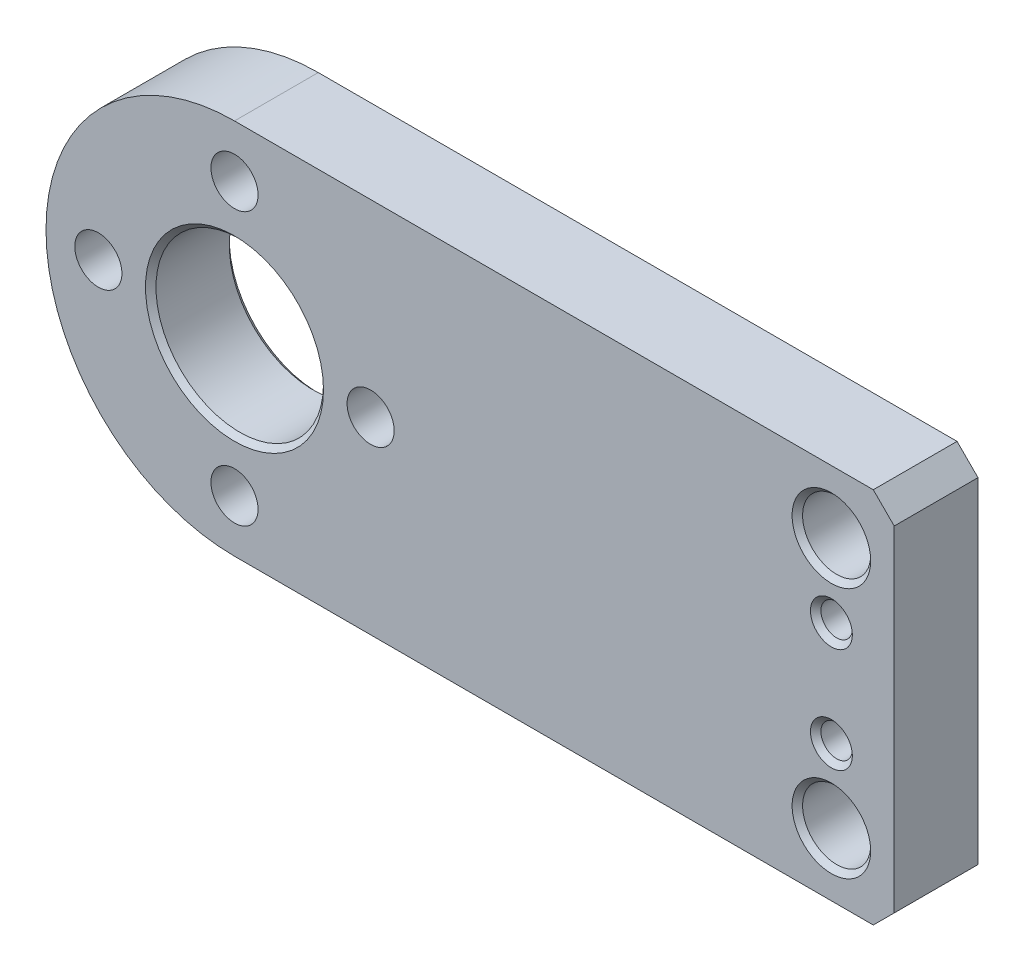
ISO-10303-21;
HEADER;
FILE_DESCRIPTION(('STEP AP214'),'2;1');
FILE_NAME('part.step','',(''),(''),'','','');
FILE_SCHEMA(('AUTOMOTIVE_DESIGN { 1 0 10303 214 1 1 1 1 }'));
ENDSEC;
DATA;
#1=APPLICATION_CONTEXT('core data for automotive mechanical design processes');
#2=APPLICATION_PROTOCOL_DEFINITION('international standard','automotive_design',2000,#1);
#3=PRODUCT_CONTEXT('',#1,'mechanical');
#4=PRODUCT('Part','Part','',(#3));
#5=PRODUCT_RELATED_PRODUCT_CATEGORY('part','',(#4));
#6=PRODUCT_DEFINITION_FORMATION('','',#4);
#7=PRODUCT_DEFINITION_CONTEXT('part definition',#1,'design');
#8=PRODUCT_DEFINITION('design','',#6,#7);
#9=PRODUCT_DEFINITION_SHAPE('','',#8);
#10=(LENGTH_UNIT() NAMED_UNIT(*) SI_UNIT(.MILLI.,.METRE.));
#11=(NAMED_UNIT(*) PLANE_ANGLE_UNIT() SI_UNIT($,.RADIAN.));
#12=(NAMED_UNIT(*) SI_UNIT($,.STERADIAN.) SOLID_ANGLE_UNIT());
#13=UNCERTAINTY_MEASURE_WITH_UNIT(LENGTH_MEASURE(1.E-05),#10,'distance_accuracy_value','');
#14=(GEOMETRIC_REPRESENTATION_CONTEXT(3) GLOBAL_UNCERTAINTY_ASSIGNED_CONTEXT((#13)) GLOBAL_UNIT_ASSIGNED_CONTEXT((#10,
#11,#12)) REPRESENTATION_CONTEXT('',''));
#15=CARTESIAN_POINT('',(0.,0.,0.));
#16=DIRECTION('',(0.,0.,1.));
#17=DIRECTION('',(1.,0.,0.));
#18=AXIS2_PLACEMENT_3D('',#15,#16,#17);
#19=CARTESIAN_POINT('',(0.,18.,8.));
#20=DIRECTION('',(0.,1.,0.));
#21=DIRECTION('',(0.,0.,1.));
#22=AXIS2_PLACEMENT_3D('',#19,#20,#21);
#23=PLANE('',#22);
#24=DIRECTION('',(1.,0.,0.));
#25=VECTOR('',#24,1.);
#26=CARTESIAN_POINT('',(0.,18.,8.));
#27=LINE('',#26,#25);
#28=CARTESIAN_POINT('',(-31.5,18.,8.));
#29=VERTEX_POINT('',#28);
#30=CARTESIAN_POINT('',(29.5,18.,8.));
#31=VERTEX_POINT('',#30);
#32=EDGE_CURVE('E103',#29,#31,#27,.T.);
#33=ORIENTED_EDGE('',*,*,#32,.T.);
#34=DIRECTION('',(0.,0.,-1.));
#35=VECTOR('',#34,1.);
#36=CARTESIAN_POINT('',(29.5,18.,0.));
#37=LINE('',#36,#35);
#38=CARTESIAN_POINT('',(29.5,18.,0.));
#39=VERTEX_POINT('',#38);
#40=EDGE_CURVE('E197',#31,#39,#37,.T.);
#41=ORIENTED_EDGE('',*,*,#40,.T.);
#42=DIRECTION('',(1.,0.,0.));
#43=VECTOR('',#42,1.);
#44=CARTESIAN_POINT('',(0.,18.,0.));
#45=LINE('',#44,#43);
#46=CARTESIAN_POINT('',(-31.5,18.,0.));
#47=VERTEX_POINT('',#46);
#48=EDGE_CURVE('E106',#47,#39,#45,.T.);
#49=ORIENTED_EDGE('',*,*,#48,.F.);
#50=DIRECTION('',(0.,0.,-1.));
#51=VECTOR('',#50,1.);
#52=CARTESIAN_POINT('',(-31.5,18.,8.));
#53=LINE('',#52,#51);
#54=EDGE_CURVE('E100',#29,#47,#53,.T.);
#55=ORIENTED_EDGE('',*,*,#54,.F.);
#56=EDGE_LOOP('',(#33,#41,#49,#55));
#57=FACE_BOUND('',#56,.T.);
#58=ADVANCED_FACE('F43',(#57),#23,.T.);
#59=CARTESIAN_POINT('',(-31.5,0.,8.));
#60=DIRECTION('',(0.,0.,-1.));
#61=DIRECTION('',(-1.,0.,0.));
#62=AXIS2_PLACEMENT_3D('',#59,#60,#61);
#63=CYLINDRICAL_SURFACE('',#62,18.);
#64=CARTESIAN_POINT('',(-31.5,0.,0.));
#65=DIRECTION('',(0.,0.,1.));
#66=DIRECTION('',(1.,0.,0.));
#67=AXIS2_PLACEMENT_3D('',#64,#65,#66);
#68=CIRCLE('',#67,18.);
#69=CARTESIAN_POINT('',(-31.5,-18.,0.));
#70=VERTEX_POINT('',#69);
#71=EDGE_CURVE('E155',#47,#70,#68,.T.);
#72=ORIENTED_EDGE('',*,*,#71,.T.);
#73=DIRECTION('',(0.,0.,-1.));
#74=VECTOR('',#73,1.);
#75=CARTESIAN_POINT('',(-31.5,-18.,8.));
#76=LINE('',#75,#74);
#77=CARTESIAN_POINT('',(-31.5,-18.,8.));
#78=VERTEX_POINT('',#77);
#79=EDGE_CURVE('E112',#78,#70,#76,.T.);
#80=ORIENTED_EDGE('',*,*,#79,.F.);
#81=CARTESIAN_POINT('',(-31.5,0.,8.));
#82=DIRECTION('',(0.,0.,1.));
#83=DIRECTION('',(1.,0.,0.));
#84=AXIS2_PLACEMENT_3D('',#81,#82,#83);
#85=CIRCLE('',#84,18.);
#86=EDGE_CURVE('E116',#29,#78,#85,.T.);
#87=ORIENTED_EDGE('',*,*,#86,.F.);
#88=ORIENTED_EDGE('',*,*,#54,.T.);
#89=EDGE_LOOP('',(#72,#80,#87,#88));
#90=FACE_BOUND('',#89,.T.);
#91=ADVANCED_FACE('F117',(#90),#63,.T.);
#92=CARTESIAN_POINT('',(0.,-18.,8.));
#93=DIRECTION('',(0.,1.,0.));
#94=DIRECTION('',(0.,0.,1.));
#95=AXIS2_PLACEMENT_3D('',#92,#93,#94);
#96=PLANE('',#95);
#97=DIRECTION('',(1.,0.,0.));
#98=VECTOR('',#97,1.);
#99=CARTESIAN_POINT('',(0.,-18.,0.));
#100=LINE('',#99,#98);
#101=CARTESIAN_POINT('',(29.5,-18.,0.));
#102=VERTEX_POINT('',#101);
#103=EDGE_CURVE('E158',#70,#102,#100,.T.);
#104=ORIENTED_EDGE('',*,*,#103,.T.);
#105=DIRECTION('',(0.,0.,1.));
#106=VECTOR('',#105,1.);
#107=CARTESIAN_POINT('',(29.5,-18.,8.));
#108=LINE('',#107,#106);
#109=CARTESIAN_POINT('',(29.5,-18.,8.));
#110=VERTEX_POINT('',#109);
#111=EDGE_CURVE('E68',#102,#110,#108,.T.);
#112=ORIENTED_EDGE('',*,*,#111,.T.);
#113=DIRECTION('',(1.,0.,0.));
#114=VECTOR('',#113,1.);
#115=CARTESIAN_POINT('',(0.,-18.,8.));
#116=LINE('',#115,#114);
#117=EDGE_CURVE('E120',#78,#110,#116,.T.);
#118=ORIENTED_EDGE('',*,*,#117,.F.);
#119=ORIENTED_EDGE('',*,*,#79,.T.);
#120=EDGE_LOOP('',(#104,#112,#118,#119));
#121=FACE_BOUND('',#120,.T.);
#122=ADVANCED_FACE('F300',(#121),#96,.F.);
#123=CARTESIAN_POINT('',(-18.4999999999998,1.2490009027033E-13,8.));
#124=DIRECTION('',(0.,0.,-1.));
#125=DIRECTION('',(-1.,0.,0.));
#126=AXIS2_PLACEMENT_3D('',#123,#124,#125);
#127=CYLINDRICAL_SURFACE('',#126,2.25);
#128=CARTESIAN_POINT('',(-18.4999999999998,1.2490009027033E-13,8.));
#129=DIRECTION('',(0.,0.,1.));
#130=DIRECTION('',(1.,0.,0.));
#131=AXIS2_PLACEMENT_3D('',#128,#129,#130);
#132=CIRCLE('',#131,2.25);
#133=CARTESIAN_POINT('',(-16.2499999999998,1.2490009027033E-13,8.));
#134=VERTEX_POINT('',#133);
#135=EDGE_CURVE('E145',#134,#134,#132,.T.);
#136=ORIENTED_EDGE('',*,*,#135,.T.);
#137=EDGE_LOOP('',(#136));
#138=FACE_BOUND('',#137,.T.);
#139=CARTESIAN_POINT('',(-18.4999999999998,1.2490009027033E-13,0.));
#140=DIRECTION('',(0.,0.,1.));
#141=DIRECTION('',(1.,0.,0.));
#142=AXIS2_PLACEMENT_3D('',#139,#140,#141);
#143=CIRCLE('',#142,2.25);
#144=CARTESIAN_POINT('',(-16.2499999999998,1.2490009027033E-13,0.));
#145=VERTEX_POINT('',#144);
#146=EDGE_CURVE('E129',#145,#145,#143,.T.);
#147=ORIENTED_EDGE('',*,*,#146,.F.);
#148=EDGE_LOOP('',(#147));
#149=FACE_BOUND('',#148,.T.);
#150=ADVANCED_FACE('F398',(#138,#149),#127,.F.);
#151=CARTESIAN_POINT('',(25.5,12.,8.));
#152=DIRECTION('',(0.,0.,-1.));
#153=DIRECTION('',(-1.,0.,0.));
#154=AXIS2_PLACEMENT_3D('',#151,#152,#153);
#155=CYLINDRICAL_SURFACE('',#154,3.25);
#156=CARTESIAN_POINT('',(25.5,12.,0.500000000000011));
#157=DIRECTION('',(0.,0.,1.));
#158=DIRECTION('',(1.,0.,0.));
#159=AXIS2_PLACEMENT_3D('',#156,#157,#158);
#160=CIRCLE('',#159,3.25);
#161=CARTESIAN_POINT('',(28.75,12.,0.500000000000011));
#162=VERTEX_POINT('',#161);
#163=EDGE_CURVE('E232',#162,#162,#160,.F.);
#164=ORIENTED_EDGE('',*,*,#163,.T.);
#165=EDGE_LOOP('',(#164));
#166=FACE_BOUND('',#165,.T.);
#167=CARTESIAN_POINT('',(25.5,12.,7.5));
#168=DIRECTION('',(0.,0.,1.));
#169=DIRECTION('',(1.,0.,0.));
#170=AXIS2_PLACEMENT_3D('',#167,#168,#169);
#171=CIRCLE('',#170,3.25);
#172=CARTESIAN_POINT('',(28.75,12.,7.5));
#173=VERTEX_POINT('',#172);
#174=EDGE_CURVE('E228',#173,#173,#171,.T.);
#175=ORIENTED_EDGE('',*,*,#174,.T.);
#176=EDGE_LOOP('',(#175));
#177=FACE_BOUND('',#176,.T.);
#178=ADVANCED_FACE('F388',(#166,#177),#155,.F.);
#179=CARTESIAN_POINT('',(25.5,5.,8.));
#180=DIRECTION('',(0.,0.,-1.));
#181=DIRECTION('',(-1.,0.,0.));
#182=AXIS2_PLACEMENT_3D('',#179,#180,#181);
#183=CYLINDRICAL_SURFACE('',#182,1.5);
#184=CARTESIAN_POINT('',(25.5,5.,0.5));
#185=DIRECTION('',(0.,0.,1.));
#186=DIRECTION('',(1.,0.,0.));
#187=AXIS2_PLACEMENT_3D('',#184,#185,#186);
#188=CIRCLE('',#187,1.5);
#189=CARTESIAN_POINT('',(27.,5.,0.5));
#190=VERTEX_POINT('',#189);
#191=EDGE_CURVE('E240',#190,#190,#188,.F.);
#192=ORIENTED_EDGE('',*,*,#191,.T.);
#193=EDGE_LOOP('',(#192));
#194=FACE_BOUND('',#193,.T.);
#195=CARTESIAN_POINT('',(25.5,5.,7.50000000000002));
#196=DIRECTION('',(0.,0.,1.));
#197=DIRECTION('',(1.,0.,0.));
#198=AXIS2_PLACEMENT_3D('',#195,#196,#197);
#199=CIRCLE('',#198,1.5);
#200=CARTESIAN_POINT('',(27.,5.,7.50000000000002));
#201=VERTEX_POINT('',#200);
#202=EDGE_CURVE('E236',#201,#201,#199,.T.);
#203=ORIENTED_EDGE('',*,*,#202,.T.);
#204=EDGE_LOOP('',(#203));
#205=FACE_BOUND('',#204,.T.);
#206=ADVANCED_FACE('F385',(#194,#205),#183,.F.);
#207=CARTESIAN_POINT('',(25.5,-5.00000000000001,8.));
#208=DIRECTION('',(0.,0.,-1.));
#209=DIRECTION('',(-1.,0.,0.));
#210=AXIS2_PLACEMENT_3D('',#207,#208,#209);
#211=CYLINDRICAL_SURFACE('',#210,1.5);
#212=CARTESIAN_POINT('',(25.5,-5.00000000000001,0.499999999999993));
#213=DIRECTION('',(0.,0.,1.));
#214=DIRECTION('',(1.,0.,0.));
#215=AXIS2_PLACEMENT_3D('',#212,#213,#214);
#216=CIRCLE('',#215,1.5);
#217=CARTESIAN_POINT('',(27.,-5.00000000000001,0.499999999999993));
#218=VERTEX_POINT('',#217);
#219=EDGE_CURVE('E248',#218,#218,#216,.F.);
#220=ORIENTED_EDGE('',*,*,#219,.T.);
#221=EDGE_LOOP('',(#220));
#222=FACE_BOUND('',#221,.T.);
#223=CARTESIAN_POINT('',(25.5,-5.00000000000001,7.49999999999999));
#224=DIRECTION('',(0.,0.,1.));
#225=DIRECTION('',(1.,0.,0.));
#226=AXIS2_PLACEMENT_3D('',#223,#224,#225);
#227=CIRCLE('',#226,1.5);
#228=CARTESIAN_POINT('',(27.,-5.00000000000001,7.49999999999999));
#229=VERTEX_POINT('',#228);
#230=EDGE_CURVE('E244',#229,#229,#227,.T.);
#231=ORIENTED_EDGE('',*,*,#230,.T.);
#232=EDGE_LOOP('',(#231));
#233=FACE_BOUND('',#232,.T.);
#234=ADVANCED_FACE('F387',(#222,#233),#211,.F.);
#235=CARTESIAN_POINT('',(-31.4999999999997,-13.,8.));
#236=DIRECTION('',(0.,0.,-1.));
#237=DIRECTION('',(-1.,0.,0.));
#238=AXIS2_PLACEMENT_3D('',#235,#236,#237);
#239=CYLINDRICAL_SURFACE('',#238,2.25);
#240=CARTESIAN_POINT('',(-31.4999999999997,-13.,8.));
#241=DIRECTION('',(0.,0.,1.));
#242=DIRECTION('',(1.,0.,0.));
#243=AXIS2_PLACEMENT_3D('',#240,#241,#242);
#244=CIRCLE('',#243,2.25);
#245=CARTESIAN_POINT('',(-29.2499999999997,-13.,8.));
#246=VERTEX_POINT('',#245);
#247=EDGE_CURVE('E141',#246,#246,#244,.T.);
#248=ORIENTED_EDGE('',*,*,#247,.T.);
#249=EDGE_LOOP('',(#248));
#250=FACE_BOUND('',#249,.T.);
#251=CARTESIAN_POINT('',(-31.4999999999997,-13.,0.));
#252=DIRECTION('',(0.,0.,1.));
#253=DIRECTION('',(1.,0.,0.));
#254=AXIS2_PLACEMENT_3D('',#251,#252,#253);
#255=CIRCLE('',#254,2.25);
#256=CARTESIAN_POINT('',(-29.2499999999997,-13.,0.));
#257=VERTEX_POINT('',#256);
#258=EDGE_CURVE('E169',#257,#257,#255,.T.);
#259=ORIENTED_EDGE('',*,*,#258,.F.);
#260=EDGE_LOOP('',(#259));
#261=FACE_BOUND('',#260,.T.);
#262=ADVANCED_FACE('F395',(#250,#261),#239,.F.);
#263=CARTESIAN_POINT('',(-44.4999999999998,0.,8.));
#264=DIRECTION('',(0.,0.,-1.));
#265=DIRECTION('',(-1.,0.,0.));
#266=AXIS2_PLACEMENT_3D('',#263,#264,#265);
#267=CYLINDRICAL_SURFACE('',#266,2.25);
#268=CARTESIAN_POINT('',(-44.4999999999998,0.,8.));
#269=DIRECTION('',(0.,0.,1.));
#270=DIRECTION('',(1.,0.,0.));
#271=AXIS2_PLACEMENT_3D('',#268,#269,#270);
#272=CIRCLE('',#271,2.25);
#273=CARTESIAN_POINT('',(-42.2499999999998,0.,8.));
#274=VERTEX_POINT('',#273);
#275=EDGE_CURVE('E137',#274,#274,#272,.T.);
#276=ORIENTED_EDGE('',*,*,#275,.T.);
#277=EDGE_LOOP('',(#276));
#278=FACE_BOUND('',#277,.T.);
#279=CARTESIAN_POINT('',(-44.4999999999998,0.,0.));
#280=DIRECTION('',(0.,0.,1.));
#281=DIRECTION('',(1.,0.,0.));
#282=AXIS2_PLACEMENT_3D('',#279,#280,#281);
#283=CIRCLE('',#282,2.25);
#284=CARTESIAN_POINT('',(-42.2499999999998,0.,0.));
#285=VERTEX_POINT('',#284);
#286=EDGE_CURVE('E165',#285,#285,#283,.T.);
#287=ORIENTED_EDGE('',*,*,#286,.F.);
#288=EDGE_LOOP('',(#287));
#289=FACE_BOUND('',#288,.T.);
#290=ADVANCED_FACE('F405',(#278,#289),#267,.F.);
#291=CARTESIAN_POINT('',(31.5,0.,8.));
#292=DIRECTION('',(-1.,0.,0.));
#293=DIRECTION('',(0.,0.,1.));
#294=AXIS2_PLACEMENT_3D('',#291,#292,#293);
#295=PLANE('',#294);
#296=DIRECTION('',(0.,1.,0.));
#297=VECTOR('',#296,1.);
#298=CARTESIAN_POINT('',(31.5,0.,8.));
#299=LINE('',#298,#297);
#300=CARTESIAN_POINT('',(31.5,-16.,8.));
#301=VERTEX_POINT('',#300);
#302=CARTESIAN_POINT('',(31.5,16.,8.));
#303=VERTEX_POINT('',#302);
#304=EDGE_CURVE('E134',#301,#303,#299,.T.);
#305=ORIENTED_EDGE('',*,*,#304,.F.);
#306=DIRECTION('',(0.,0.,-1.));
#307=VECTOR('',#306,1.);
#308=CARTESIAN_POINT('',(31.5,-16.,8.));
#309=LINE('',#308,#307);
#310=CARTESIAN_POINT('',(31.5,-16.,0.));
#311=VERTEX_POINT('',#310);
#312=EDGE_CURVE('E180',#301,#311,#309,.T.);
#313=ORIENTED_EDGE('',*,*,#312,.T.);
#314=DIRECTION('',(0.,1.,0.));
#315=VECTOR('',#314,1.);
#316=CARTESIAN_POINT('',(31.5,0.,0.));
#317=LINE('',#316,#315);
#318=CARTESIAN_POINT('',(31.5,16.,0.));
#319=VERTEX_POINT('',#318);
#320=EDGE_CURVE('E161',#311,#319,#317,.T.);
#321=ORIENTED_EDGE('',*,*,#320,.T.);
#322=DIRECTION('',(0.,0.,1.));
#323=VECTOR('',#322,1.);
#324=CARTESIAN_POINT('',(31.5,16.,8.));
#325=LINE('',#324,#323);
#326=EDGE_CURVE('E111',#319,#303,#325,.T.);
#327=ORIENTED_EDGE('',*,*,#326,.T.);
#328=EDGE_LOOP('',(#305,#313,#321,#327));
#329=FACE_BOUND('',#328,.T.);
#330=ADVANCED_FACE('F308',(#329),#295,.F.);
#331=CARTESIAN_POINT('',(-31.5,13.,8.));
#332=DIRECTION('',(0.,0.,-1.));
#333=DIRECTION('',(-1.,0.,0.));
#334=AXIS2_PLACEMENT_3D('',#331,#332,#333);
#335=CYLINDRICAL_SURFACE('',#334,2.25);
#336=CARTESIAN_POINT('',(-31.5,13.,8.));
#337=DIRECTION('',(0.,0.,1.));
#338=DIRECTION('',(1.,0.,0.));
#339=AXIS2_PLACEMENT_3D('',#336,#337,#338);
#340=CIRCLE('',#339,2.25);
#341=CARTESIAN_POINT('',(-29.25,13.,8.));
#342=VERTEX_POINT('',#341);
#343=EDGE_CURVE('E125',#342,#342,#340,.T.);
#344=ORIENTED_EDGE('',*,*,#343,.T.);
#345=EDGE_LOOP('',(#344));
#346=FACE_BOUND('',#345,.T.);
#347=CARTESIAN_POINT('',(-31.5,13.,0.));
#348=DIRECTION('',(0.,0.,1.));
#349=DIRECTION('',(1.,0.,0.));
#350=AXIS2_PLACEMENT_3D('',#347,#348,#349);
#351=CIRCLE('',#350,2.25);
#352=CARTESIAN_POINT('',(-29.25,13.,0.));
#353=VERTEX_POINT('',#352);
#354=EDGE_CURVE('E149',#353,#353,#351,.T.);
#355=ORIENTED_EDGE('',*,*,#354,.F.);
#356=EDGE_LOOP('',(#355));
#357=FACE_BOUND('',#356,.T.);
#358=ADVANCED_FACE('F304',(#346,#357),#335,.F.);
#359=CARTESIAN_POINT('',(-31.5,0.,8.));
#360=DIRECTION('',(0.,0.,-1.));
#361=DIRECTION('',(-1.,0.,0.));
#362=AXIS2_PLACEMENT_3D('',#359,#360,#361);
#363=CYLINDRICAL_SURFACE('',#362,8.);
#364=CARTESIAN_POINT('',(-31.5,0.,0.500000000000013));
#365=DIRECTION('',(0.,0.,1.));
#366=DIRECTION('',(1.,0.,0.));
#367=AXIS2_PLACEMENT_3D('',#364,#365,#366);
#368=CIRCLE('',#367,8.);
#369=CARTESIAN_POINT('',(-23.5,0.,0.500000000000013));
#370=VERTEX_POINT('',#369);
#371=EDGE_CURVE('E224',#370,#370,#368,.F.);
#372=ORIENTED_EDGE('',*,*,#371,.T.);
#373=EDGE_LOOP('',(#372));
#374=FACE_BOUND('',#373,.T.);
#375=CARTESIAN_POINT('',(-31.5,0.,7.50000000000001));
#376=DIRECTION('',(0.,0.,1.));
#377=DIRECTION('',(1.,0.,0.));
#378=AXIS2_PLACEMENT_3D('',#375,#376,#377);
#379=CIRCLE('',#378,8.);
#380=CARTESIAN_POINT('',(-23.5,0.,7.50000000000001));
#381=VERTEX_POINT('',#380);
#382=EDGE_CURVE('E220',#381,#381,#379,.T.);
#383=ORIENTED_EDGE('',*,*,#382,.T.);
#384=EDGE_LOOP('',(#383));
#385=FACE_BOUND('',#384,.T.);
#386=ADVANCED_FACE('F307',(#374,#385),#363,.F.);
#387=CARTESIAN_POINT('',(25.5,-12.,8.));
#388=DIRECTION('',(0.,0.,-1.));
#389=DIRECTION('',(-1.,0.,0.));
#390=AXIS2_PLACEMENT_3D('',#387,#388,#389);
#391=CYLINDRICAL_SURFACE('',#390,3.25);
#392=CARTESIAN_POINT('',(25.5,-12.,0.5));
#393=DIRECTION('',(0.,0.,1.));
#394=DIRECTION('',(1.,0.,0.));
#395=AXIS2_PLACEMENT_3D('',#392,#393,#394);
#396=CIRCLE('',#395,3.25);
#397=CARTESIAN_POINT('',(28.75,-12.,0.5));
#398=VERTEX_POINT('',#397);
#399=EDGE_CURVE('E256',#398,#398,#396,.F.);
#400=ORIENTED_EDGE('',*,*,#399,.T.);
#401=EDGE_LOOP('',(#400));
#402=FACE_BOUND('',#401,.T.);
#403=CARTESIAN_POINT('',(25.5,-12.,7.5));
#404=DIRECTION('',(0.,0.,1.));
#405=DIRECTION('',(1.,0.,0.));
#406=AXIS2_PLACEMENT_3D('',#403,#404,#405);
#407=CIRCLE('',#406,3.25);
#408=CARTESIAN_POINT('',(28.75,-12.,7.5));
#409=VERTEX_POINT('',#408);
#410=EDGE_CURVE('E252',#409,#409,#407,.T.);
#411=ORIENTED_EDGE('',*,*,#410,.T.);
#412=EDGE_LOOP('',(#411));
#413=FACE_BOUND('',#412,.T.);
#414=ADVANCED_FACE('F312',(#402,#413),#391,.F.);
#415=CARTESIAN_POINT('',(0.,0.,8.));
#416=DIRECTION('',(0.,0.,1.));
#417=DIRECTION('',(1.,0.,0.));
#418=AXIS2_PLACEMENT_3D('',#415,#416,#417);
#419=PLANE('',#418);
#420=CARTESIAN_POINT('',(25.5,-12.,8.));
#421=DIRECTION('',(0.,0.,1.));
#422=DIRECTION('',(1.,0.,0.));
#423=AXIS2_PLACEMENT_3D('',#420,#421,#422);
#424=CIRCLE('',#423,3.75);
#425=CARTESIAN_POINT('',(29.25,-12.,8.));
#426=VERTEX_POINT('',#425);
#427=EDGE_CURVE('E11',#426,#426,#424,.F.);
#428=ORIENTED_EDGE('',*,*,#427,.T.);
#429=EDGE_LOOP('',(#428));
#430=FACE_BOUND('',#429,.T.);
#431=CARTESIAN_POINT('',(25.5,-5.00000000000001,8.));
#432=DIRECTION('',(0.,0.,1.));
#433=DIRECTION('',(1.,0.,0.));
#434=AXIS2_PLACEMENT_3D('',#431,#432,#433);
#435=CIRCLE('',#434,2.00000000000001);
#436=CARTESIAN_POINT('',(27.5,-5.00000000000001,8.));
#437=VERTEX_POINT('',#436);
#438=EDGE_CURVE('E53',#437,#437,#435,.F.);
#439=ORIENTED_EDGE('',*,*,#438,.T.);
#440=EDGE_LOOP('',(#439));
#441=FACE_BOUND('',#440,.T.);
#442=CARTESIAN_POINT('',(25.5,12.,8.));
#443=DIRECTION('',(0.,0.,1.));
#444=DIRECTION('',(1.,0.,0.));
#445=AXIS2_PLACEMENT_3D('',#442,#443,#444);
#446=CIRCLE('',#445,3.75);
#447=CARTESIAN_POINT('',(29.25,12.,8.));
#448=VERTEX_POINT('',#447);
#449=EDGE_CURVE('E268',#448,#448,#446,.F.);
#450=ORIENTED_EDGE('',*,*,#449,.T.);
#451=EDGE_LOOP('',(#450));
#452=FACE_BOUND('',#451,.T.);
#453=CARTESIAN_POINT('',(25.5,5.,8.));
#454=DIRECTION('',(0.,0.,1.));
#455=DIRECTION('',(1.,0.,0.));
#456=AXIS2_PLACEMENT_3D('',#453,#454,#455);
#457=CIRCLE('',#456,1.99999999999997);
#458=CARTESIAN_POINT('',(27.5,5.,8.));
#459=VERTEX_POINT('',#458);
#460=EDGE_CURVE('E264',#459,#459,#457,.F.);
#461=ORIENTED_EDGE('',*,*,#460,.T.);
#462=EDGE_LOOP('',(#461));
#463=FACE_BOUND('',#462,.T.);
#464=CARTESIAN_POINT('',(-31.5,0.,8.));
#465=DIRECTION('',(0.,0.,1.));
#466=DIRECTION('',(1.,0.,0.));
#467=AXIS2_PLACEMENT_3D('',#464,#465,#466);
#468=CIRCLE('',#467,8.49999999999998);
#469=CARTESIAN_POINT('',(-23.,0.,8.));
#470=VERTEX_POINT('',#469);
#471=EDGE_CURVE('E260',#470,#470,#468,.F.);
#472=ORIENTED_EDGE('',*,*,#471,.T.);
#473=EDGE_LOOP('',(#472));
#474=FACE_BOUND('',#473,.T.);
#475=ORIENTED_EDGE('',*,*,#343,.F.);
#476=EDGE_LOOP('',(#475));
#477=FACE_BOUND('',#476,.T.);
#478=ORIENTED_EDGE('',*,*,#117,.T.);
#479=DIRECTION('',(-0.707106781186548,-0.707106781186548,0.));
#480=VECTOR('',#479,1.);
#481=CARTESIAN_POINT('',(23.75,-23.75,8.));
#482=LINE('',#481,#480);
#483=EDGE_CURVE('E194',#110,#301,#482,.F.);
#484=ORIENTED_EDGE('',*,*,#483,.T.);
#485=ORIENTED_EDGE('',*,*,#304,.T.);
#486=DIRECTION('',(-0.707106781186548,0.707106781186548,0.));
#487=VECTOR('',#486,1.);
#488=CARTESIAN_POINT('',(23.75,23.75,8.));
#489=LINE('',#488,#487);
#490=EDGE_CURVE('E60',#303,#31,#489,.T.);
#491=ORIENTED_EDGE('',*,*,#490,.T.);
#492=ORIENTED_EDGE('',*,*,#32,.F.);
#493=ORIENTED_EDGE('',*,*,#86,.T.);
#494=EDGE_LOOP('',(#478,#484,#485,#491,#492,#493));
#495=FACE_BOUND('',#494,.T.);
#496=ORIENTED_EDGE('',*,*,#275,.F.);
#497=EDGE_LOOP('',(#496));
#498=FACE_BOUND('',#497,.T.);
#499=ORIENTED_EDGE('',*,*,#247,.F.);
#500=EDGE_LOOP('',(#499));
#501=FACE_BOUND('',#500,.T.);
#502=ORIENTED_EDGE('',*,*,#135,.F.);
#503=EDGE_LOOP('',(#502));
#504=FACE_BOUND('',#503,.T.);
#505=ADVANCED_FACE('F122',(#430,#441,#452,#463,#474,#477,#495,#498,#501,#504),#419,.T.);
#506=CARTESIAN_POINT('',(0.,0.,0.));
#507=DIRECTION('',(0.,0.,1.));
#508=DIRECTION('',(1.,0.,0.));
#509=AXIS2_PLACEMENT_3D('',#506,#507,#508);
#510=PLANE('',#509);
#511=CARTESIAN_POINT('',(-31.5,0.,0.));
#512=DIRECTION('',(0.,0.,1.));
#513=DIRECTION('',(1.,0.,0.));
#514=AXIS2_PLACEMENT_3D('',#511,#512,#513);
#515=CIRCLE('',#514,8.50000000000001);
#516=CARTESIAN_POINT('',(-23.,0.,0.));
#517=VERTEX_POINT('',#516);
#518=EDGE_CURVE('E216',#517,#517,#515,.T.);
#519=ORIENTED_EDGE('',*,*,#518,.T.);
#520=EDGE_LOOP('',(#519));
#521=FACE_BOUND('',#520,.T.);
#522=CARTESIAN_POINT('',(25.5,12.,0.));
#523=DIRECTION('',(0.,0.,1.));
#524=DIRECTION('',(1.,0.,0.));
#525=AXIS2_PLACEMENT_3D('',#522,#523,#524);
#526=CIRCLE('',#525,3.75000000000001);
#527=CARTESIAN_POINT('',(29.25,12.,0.));
#528=VERTEX_POINT('',#527);
#529=EDGE_CURVE('E212',#528,#528,#526,.T.);
#530=ORIENTED_EDGE('',*,*,#529,.T.);
#531=EDGE_LOOP('',(#530));
#532=FACE_BOUND('',#531,.T.);
#533=CARTESIAN_POINT('',(25.5,5.,0.));
#534=DIRECTION('',(0.,0.,1.));
#535=DIRECTION('',(1.,0.,0.));
#536=AXIS2_PLACEMENT_3D('',#533,#534,#535);
#537=CIRCLE('',#536,1.99999999999999);
#538=CARTESIAN_POINT('',(27.5,5.,0.));
#539=VERTEX_POINT('',#538);
#540=EDGE_CURVE('E208',#539,#539,#537,.T.);
#541=ORIENTED_EDGE('',*,*,#540,.T.);
#542=EDGE_LOOP('',(#541));
#543=FACE_BOUND('',#542,.T.);
#544=CARTESIAN_POINT('',(25.5,-5.00000000000001,0.));
#545=DIRECTION('',(0.,0.,1.));
#546=DIRECTION('',(1.,0.,0.));
#547=AXIS2_PLACEMENT_3D('',#544,#545,#546);
#548=CIRCLE('',#547,1.99999999999999);
#549=CARTESIAN_POINT('',(27.5,-5.00000000000001,0.));
#550=VERTEX_POINT('',#549);
#551=EDGE_CURVE('E204',#550,#550,#548,.T.);
#552=ORIENTED_EDGE('',*,*,#551,.T.);
#553=EDGE_LOOP('',(#552));
#554=FACE_BOUND('',#553,.T.);
#555=CARTESIAN_POINT('',(25.5,-12.,0.));
#556=DIRECTION('',(0.,0.,1.));
#557=DIRECTION('',(1.,0.,0.));
#558=AXIS2_PLACEMENT_3D('',#555,#556,#557);
#559=CIRCLE('',#558,3.74999999999999);
#560=CARTESIAN_POINT('',(29.25,-12.,0.));
#561=VERTEX_POINT('',#560);
#562=EDGE_CURVE('E200',#561,#561,#559,.T.);
#563=ORIENTED_EDGE('',*,*,#562,.T.);
#564=EDGE_LOOP('',(#563));
#565=FACE_BOUND('',#564,.T.);
#566=ORIENTED_EDGE('',*,*,#354,.T.);
#567=EDGE_LOOP('',(#566));
#568=FACE_BOUND('',#567,.T.);
#569=ORIENTED_EDGE('',*,*,#320,.F.);
#570=DIRECTION('',(0.707106781186548,0.707106781186548,0.));
#571=VECTOR('',#570,1.);
#572=CARTESIAN_POINT('',(31.5,-16.,0.));
#573=LINE('',#572,#571);
#574=EDGE_CURVE('E187',#311,#102,#573,.F.);
#575=ORIENTED_EDGE('',*,*,#574,.T.);
#576=ORIENTED_EDGE('',*,*,#103,.F.);
#577=ORIENTED_EDGE('',*,*,#71,.F.);
#578=ORIENTED_EDGE('',*,*,#48,.T.);
#579=DIRECTION('',(0.707106781186548,-0.707106781186548,0.));
#580=VECTOR('',#579,1.);
#581=CARTESIAN_POINT('',(29.5,18.,0.));
#582=LINE('',#581,#580);
#583=EDGE_CURVE('E184',#39,#319,#582,.T.);
#584=ORIENTED_EDGE('',*,*,#583,.T.);
#585=EDGE_LOOP('',(#569,#575,#576,#577,#578,#584));
#586=FACE_BOUND('',#585,.T.);
#587=ORIENTED_EDGE('',*,*,#286,.T.);
#588=EDGE_LOOP('',(#587));
#589=FACE_BOUND('',#588,.T.);
#590=ORIENTED_EDGE('',*,*,#258,.T.);
#591=EDGE_LOOP('',(#590));
#592=FACE_BOUND('',#591,.T.);
#593=ORIENTED_EDGE('',*,*,#146,.T.);
#594=EDGE_LOOP('',(#593));
#595=FACE_BOUND('',#594,.T.);
#596=ADVANCED_FACE('F322',(#521,#532,#543,#554,#565,#568,#586,#589,#592,#595),#510,.F.);
#597=CARTESIAN_POINT('',(31.5,-16.,8.));
#598=DIRECTION('',(-0.707106781186547,0.707106781186547,0.));
#599=DIRECTION('',(0.,0.,-1.));
#600=AXIS2_PLACEMENT_3D('',#597,#598,#599);
#601=PLANE('',#600);
#602=ORIENTED_EDGE('',*,*,#483,.F.);
#603=ORIENTED_EDGE('',*,*,#111,.F.);
#604=ORIENTED_EDGE('',*,*,#574,.F.);
#605=ORIENTED_EDGE('',*,*,#312,.F.);
#606=EDGE_LOOP('',(#602,#603,#604,#605));
#607=FACE_BOUND('',#606,.T.);
#608=ADVANCED_FACE('F315',(#607),#601,.F.);
#609=CARTESIAN_POINT('',(29.5,18.,8.));
#610=DIRECTION('',(0.707106781186547,0.707106781186547,0.));
#611=DIRECTION('',(0.,0.,1.));
#612=AXIS2_PLACEMENT_3D('',#609,#610,#611);
#613=PLANE('',#612);
#614=ORIENTED_EDGE('',*,*,#490,.F.);
#615=ORIENTED_EDGE('',*,*,#326,.F.);
#616=ORIENTED_EDGE('',*,*,#583,.F.);
#617=ORIENTED_EDGE('',*,*,#40,.F.);
#618=EDGE_LOOP('',(#614,#615,#616,#617));
#619=FACE_BOUND('',#618,.T.);
#620=ADVANCED_FACE('F321',(#619),#613,.T.);
#621=CARTESIAN_POINT('',(-31.5,0.,0.));
#622=DIRECTION('',(0.,0.,-1.));
#623=DIRECTION('',(-1.,0.,0.));
#624=AXIS2_PLACEMENT_3D('',#621,#622,#623);
#625=CONICAL_SURFACE('',#624,8.50000000000001,0.785398163397448);
#626=ORIENTED_EDGE('',*,*,#371,.F.);
#627=EDGE_LOOP('',(#626));
#628=FACE_BOUND('',#627,.T.);
#629=ORIENTED_EDGE('',*,*,#518,.F.);
#630=EDGE_LOOP('',(#629));
#631=FACE_BOUND('',#630,.T.);
#632=ADVANCED_FACE('F329',(#628,#631),#625,.F.);
#633=CARTESIAN_POINT('',(25.5,12.,0.));
#634=DIRECTION('',(0.,0.,-1.));
#635=DIRECTION('',(-1.,0.,0.));
#636=AXIS2_PLACEMENT_3D('',#633,#634,#635);
#637=CONICAL_SURFACE('',#636,3.75000000000001,0.785398163397447);
#638=ORIENTED_EDGE('',*,*,#163,.F.);
#639=EDGE_LOOP('',(#638));
#640=FACE_BOUND('',#639,.T.);
#641=ORIENTED_EDGE('',*,*,#529,.F.);
#642=EDGE_LOOP('',(#641));
#643=FACE_BOUND('',#642,.T.);
#644=ADVANCED_FACE('F336',(#640,#643),#637,.F.);
#645=CARTESIAN_POINT('',(25.5,5.,0.));
#646=DIRECTION('',(0.,0.,-1.));
#647=DIRECTION('',(-1.,0.,0.));
#648=AXIS2_PLACEMENT_3D('',#645,#646,#647);
#649=CONICAL_SURFACE('',#648,1.99999999999999,0.785398163397443);
#650=ORIENTED_EDGE('',*,*,#191,.F.);
#651=EDGE_LOOP('',(#650));
#652=FACE_BOUND('',#651,.T.);
#653=ORIENTED_EDGE('',*,*,#540,.F.);
#654=EDGE_LOOP('',(#653));
#655=FACE_BOUND('',#654,.T.);
#656=ADVANCED_FACE('F343',(#652,#655),#649,.F.);
#657=CARTESIAN_POINT('',(25.5,-5.00000000000001,0.499999999999993));
#658=DIRECTION('',(0.,0.,-1.));
#659=DIRECTION('',(-1.,0.,0.));
#660=AXIS2_PLACEMENT_3D('',#657,#658,#659);
#661=CONICAL_SURFACE('',#660,1.5,0.785398163397443);
#662=ORIENTED_EDGE('',*,*,#551,.F.);
#663=EDGE_LOOP('',(#662));
#664=FACE_BOUND('',#663,.T.);
#665=ORIENTED_EDGE('',*,*,#219,.F.);
#666=EDGE_LOOP('',(#665));
#667=FACE_BOUND('',#666,.T.);
#668=ADVANCED_FACE('F350',(#664,#667),#661,.F.);
#669=CARTESIAN_POINT('',(25.5,-12.,0.5));
#670=DIRECTION('',(0.,0.,-1.));
#671=DIRECTION('',(-1.,0.,0.));
#672=AXIS2_PLACEMENT_3D('',#669,#670,#671);
#673=CONICAL_SURFACE('',#672,3.25,0.785398163397437);
#674=ORIENTED_EDGE('',*,*,#562,.F.);
#675=EDGE_LOOP('',(#674));
#676=FACE_BOUND('',#675,.T.);
#677=ORIENTED_EDGE('',*,*,#399,.F.);
#678=EDGE_LOOP('',(#677));
#679=FACE_BOUND('',#678,.T.);
#680=ADVANCED_FACE('F290',(#676,#679),#673,.F.);
#681=CARTESIAN_POINT('',(25.5,-12.,8.));
#682=DIRECTION('',(0.,0.,1.));
#683=DIRECTION('',(1.,0.,0.));
#684=AXIS2_PLACEMENT_3D('',#681,#682,#683);
#685=CONICAL_SURFACE('',#684,3.75,0.785398163397447);
#686=ORIENTED_EDGE('',*,*,#410,.F.);
#687=EDGE_LOOP('',(#686));
#688=FACE_BOUND('',#687,.T.);
#689=ORIENTED_EDGE('',*,*,#427,.F.);
#690=EDGE_LOOP('',(#689));
#691=FACE_BOUND('',#690,.T.);
#692=ADVANCED_FACE('F280',(#688,#691),#685,.F.);
#693=CARTESIAN_POINT('',(25.5,-5.00000000000001,8.));
#694=DIRECTION('',(0.,0.,1.));
#695=DIRECTION('',(1.,0.,0.));
#696=AXIS2_PLACEMENT_3D('',#693,#694,#695);
#697=CONICAL_SURFACE('',#696,2.00000000000001,0.78539816339745);
#698=ORIENTED_EDGE('',*,*,#230,.F.);
#699=EDGE_LOOP('',(#698));
#700=FACE_BOUND('',#699,.T.);
#701=ORIENTED_EDGE('',*,*,#438,.F.);
#702=EDGE_LOOP('',(#701));
#703=FACE_BOUND('',#702,.T.);
#704=ADVANCED_FACE('F277',(#700,#703),#697,.F.);
#705=CARTESIAN_POINT('',(25.5,12.,7.5));
#706=DIRECTION('',(0.,0.,1.));
#707=DIRECTION('',(1.,0.,0.));
#708=AXIS2_PLACEMENT_3D('',#705,#706,#707);
#709=CONICAL_SURFACE('',#708,3.25,0.785398163397451);
#710=ORIENTED_EDGE('',*,*,#449,.F.);
#711=EDGE_LOOP('',(#710));
#712=FACE_BOUND('',#711,.T.);
#713=ORIENTED_EDGE('',*,*,#174,.F.);
#714=EDGE_LOOP('',(#713));
#715=FACE_BOUND('',#714,.T.);
#716=ADVANCED_FACE('F279',(#712,#715),#709,.F.);
#717=CARTESIAN_POINT('',(25.5,5.,7.50000000000002));
#718=DIRECTION('',(0.,0.,1.));
#719=DIRECTION('',(1.,0.,0.));
#720=AXIS2_PLACEMENT_3D('',#717,#718,#719);
#721=CONICAL_SURFACE('',#720,1.5,0.785398163397443);
#722=ORIENTED_EDGE('',*,*,#460,.F.);
#723=EDGE_LOOP('',(#722));
#724=FACE_BOUND('',#723,.T.);
#725=ORIENTED_EDGE('',*,*,#202,.F.);
#726=EDGE_LOOP('',(#725));
#727=FACE_BOUND('',#726,.T.);
#728=ADVANCED_FACE('F287',(#724,#727),#721,.F.);
#729=CARTESIAN_POINT('',(-31.5,0.,7.50000000000001));
#730=DIRECTION('',(0.,0.,1.));
#731=DIRECTION('',(1.,0.,0.));
#732=AXIS2_PLACEMENT_3D('',#729,#730,#731);
#733=CONICAL_SURFACE('',#732,8.,0.785398163397434);
#734=ORIENTED_EDGE('',*,*,#471,.F.);
#735=EDGE_LOOP('',(#734));
#736=FACE_BOUND('',#735,.T.);
#737=ORIENTED_EDGE('',*,*,#382,.F.);
#738=EDGE_LOOP('',(#737));
#739=FACE_BOUND('',#738,.T.);
#740=ADVANCED_FACE('F46',(#736,#739),#733,.F.);
#741=CLOSED_SHELL('',(#58,#91,#122,#150,#178,#206,#234,#262,#290,#330,#358,#386,#414,#505,#596,
#608,#620,#632,#644,#656,#668,#680,#692,#704,#716,#728,#740));
#742=MANIFOLD_SOLID_BREP('B2',#741);
#743=ADVANCED_BREP_SHAPE_REPRESENTATION('',(#18,#742),#14);
#744=SHAPE_DEFINITION_REPRESENTATION(#9,#743);
ENDSEC;
END-ISO-10303-21;
